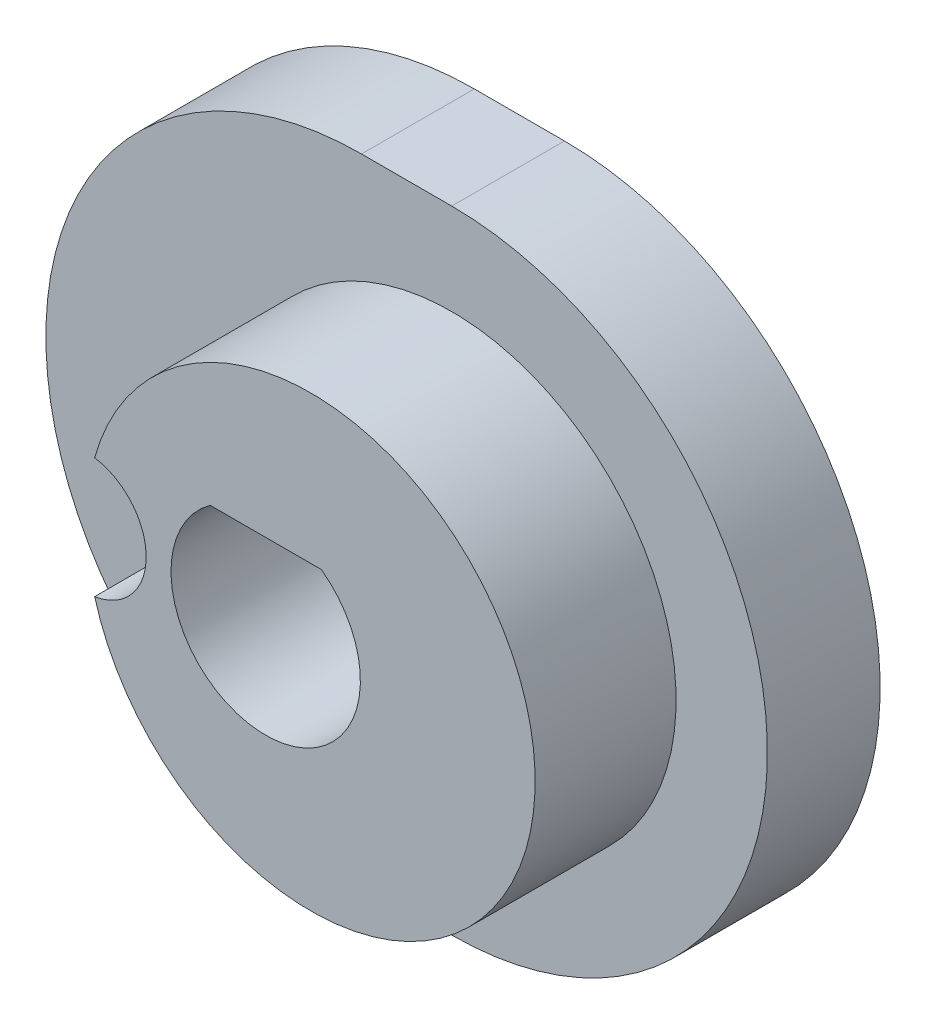
ISO-10303-21;
HEADER;
FILE_DESCRIPTION(('STEP AP214'),'2;1');
FILE_NAME('part.step','',(''),(''),'','','');
FILE_SCHEMA(('AUTOMOTIVE_DESIGN { 1 0 10303 214 1 1 1 1 }'));
ENDSEC;
DATA;
#1=APPLICATION_CONTEXT('core data for automotive mechanical design processes');
#2=APPLICATION_PROTOCOL_DEFINITION('international standard','automotive_design',2000,#1);
#3=PRODUCT_CONTEXT('',#1,'mechanical');
#4=PRODUCT('Part','Part','',(#3));
#5=PRODUCT_RELATED_PRODUCT_CATEGORY('part','',(#4));
#6=PRODUCT_DEFINITION_FORMATION('','',#4);
#7=PRODUCT_DEFINITION_CONTEXT('part definition',#1,'design');
#8=PRODUCT_DEFINITION('design','',#6,#7);
#9=PRODUCT_DEFINITION_SHAPE('','',#8);
#10=(LENGTH_UNIT() NAMED_UNIT(*) SI_UNIT(.MILLI.,.METRE.));
#11=(NAMED_UNIT(*) PLANE_ANGLE_UNIT() SI_UNIT($,.RADIAN.));
#12=(NAMED_UNIT(*) SI_UNIT($,.STERADIAN.) SOLID_ANGLE_UNIT());
#13=UNCERTAINTY_MEASURE_WITH_UNIT(LENGTH_MEASURE(1.E-05),#10,'distance_accuracy_value','');
#14=(GEOMETRIC_REPRESENTATION_CONTEXT(3) GLOBAL_UNCERTAINTY_ASSIGNED_CONTEXT((#13)) GLOBAL_UNIT_ASSIGNED_CONTEXT((#10,
#11,#12)) REPRESENTATION_CONTEXT('',''));
#15=CARTESIAN_POINT('',(0.,0.,0.));
#16=DIRECTION('',(0.,0.,1.));
#17=DIRECTION('',(1.,0.,0.));
#18=AXIS2_PLACEMENT_3D('',#15,#16,#17);
#19=CARTESIAN_POINT('',(2.54,0.,7.14375));
#20=DIRECTION('',(0.,0.,-1.));
#21=DIRECTION('',(-1.,0.,0.));
#22=AXIS2_PLACEMENT_3D('',#19,#20,#21);
#23=CYLINDRICAL_SURFACE('',#22,6.31825);
#24=DIRECTION('',(0.,0.,-1.));
#25=VECTOR('',#24,1.);
#26=CARTESIAN_POINT('',(-3.546871875,1.69418825395349,3.254375));
#27=LINE('',#26,#25);
#28=CARTESIAN_POINT('',(-3.546871875,1.69418825395349,7.14375));
#29=VERTEX_POINT('',#28);
#30=CARTESIAN_POINT('',(-3.546871875,1.69418825395349,3.175));
#31=VERTEX_POINT('',#30);
#32=EDGE_CURVE('E112',#29,#31,#27,.T.);
#33=ORIENTED_EDGE('',*,*,#32,.F.);
#34=CARTESIAN_POINT('',(2.54,0.,7.14375));
#35=DIRECTION('',(0.,0.,1.));
#36=DIRECTION('',(1.,0.,0.));
#37=AXIS2_PLACEMENT_3D('',#34,#35,#36);
#38=CIRCLE('',#37,6.31825);
#39=CARTESIAN_POINT('',(-3.546871875,-1.69418825395349,7.14375));
#40=VERTEX_POINT('',#39);
#41=EDGE_CURVE('E125',#40,#29,#38,.T.);
#42=ORIENTED_EDGE('',*,*,#41,.F.);
#43=DIRECTION('',(0.,0.,-1.));
#44=VECTOR('',#43,1.);
#45=CARTESIAN_POINT('',(-3.546871875,-1.69418825395349,3.254375));
#46=LINE('',#45,#44);
#47=CARTESIAN_POINT('',(-3.546871875,-1.6941882539535,3.175));
#48=VERTEX_POINT('',#47);
#49=EDGE_CURVE('E114',#48,#40,#46,.F.);
#50=ORIENTED_EDGE('',*,*,#49,.F.);
#51=CARTESIAN_POINT('',(2.54,0.,3.175));
#52=DIRECTION('',(0.,0.,1.));
#53=DIRECTION('',(1.,0.,0.));
#54=AXIS2_PLACEMENT_3D('',#51,#52,#53);
#55=CIRCLE('',#54,6.31825);
#56=EDGE_CURVE('E11',#48,#31,#55,.T.);
#57=ORIENTED_EDGE('',*,*,#56,.T.);
#58=EDGE_LOOP('',(#33,#42,#50,#57));
#59=FACE_BOUND('',#58,.T.);
#60=ADVANCED_FACE('F44',(#59),#23,.T.);
#61=CARTESIAN_POINT('',(2.54,0.,7.14375));
#62=DIRECTION('',(0.,0.,1.));
#63=DIRECTION('',(1.,0.,0.));
#64=AXIS2_PLACEMENT_3D('',#61,#62,#63);
#65=PLANE('',#64);
#66=CARTESIAN_POINT('',(1.27000000000009,0.,7.14375));
#67=DIRECTION('',(0.,0.,1.));
#68=DIRECTION('',(1.,0.,0.));
#69=AXIS2_PLACEMENT_3D('',#66,#67,#68);
#70=CIRCLE('',#69,2.667);
#71=CARTESIAN_POINT('',(-0.295761156754033,2.15899999999997,7.14375));
#72=VERTEX_POINT('',#71);
#73=CARTESIAN_POINT('',(2.83576115675421,2.15899999999997,7.14375));
#74=VERTEX_POINT('',#73);
#75=EDGE_CURVE('E127',#72,#74,#70,.T.);
#76=ORIENTED_EDGE('',*,*,#75,.F.);
#77=DIRECTION('',(-1.,0.,0.));
#78=VECTOR('',#77,1.);
#79=CARTESIAN_POINT('',(2.83576115675421,2.15899999999997,7.14375));
#80=LINE('',#79,#78);
#81=EDGE_CURVE('E139',#74,#72,#80,.T.);
#82=ORIENTED_EDGE('',*,*,#81,.F.);
#83=EDGE_LOOP('',(#76,#82));
#84=FACE_BOUND('',#83,.T.);
#85=CARTESIAN_POINT('',(-3.81,0.,7.14375));
#86=DIRECTION('',(0.,0.,1.));
#87=DIRECTION('',(1.,0.,0.));
#88=AXIS2_PLACEMENT_3D('',#85,#86,#87);
#89=CIRCLE('',#88,1.7145);
#90=EDGE_CURVE('E109',#40,#29,#89,.T.);
#91=ORIENTED_EDGE('',*,*,#90,.F.);
#92=ORIENTED_EDGE('',*,*,#41,.T.);
#93=EDGE_LOOP('',(#91,#92));
#94=FACE_BOUND('',#93,.T.);
#95=ADVANCED_FACE('F126',(#84,#94),#65,.T.);
#96=CARTESIAN_POINT('',(0.,0.,3.175));
#97=DIRECTION('',(0.,0.,-1.));
#98=DIRECTION('',(-1.,0.,0.));
#99=AXIS2_PLACEMENT_3D('',#96,#97,#98);
#100=CYLINDRICAL_SURFACE('',#99,8.89);
#101=CARTESIAN_POINT('',(0.,0.,0.));
#102=DIRECTION('',(0.,0.,1.));
#103=DIRECTION('',(1.,0.,0.));
#104=AXIS2_PLACEMENT_3D('',#101,#102,#103);
#105=CIRCLE('',#104,8.89);
#106=CARTESIAN_POINT('',(0.,8.89,0.));
#107=VERTEX_POINT('',#106);
#108=CARTESIAN_POINT('',(0.,-8.89,0.));
#109=VERTEX_POINT('',#108);
#110=EDGE_CURVE('E128',#107,#109,#105,.T.);
#111=ORIENTED_EDGE('',*,*,#110,.T.);
#112=DIRECTION('',(0.,0.,-1.));
#113=VECTOR('',#112,1.);
#114=CARTESIAN_POINT('',(0.,-8.89,3.175));
#115=LINE('',#114,#113);
#116=CARTESIAN_POINT('',(0.,-8.89,3.175));
#117=VERTEX_POINT('',#116);
#118=EDGE_CURVE('E47',#117,#109,#115,.T.);
#119=ORIENTED_EDGE('',*,*,#118,.F.);
#120=CARTESIAN_POINT('',(0.,0.,3.175));
#121=DIRECTION('',(0.,0.,1.));
#122=DIRECTION('',(1.,0.,0.));
#123=AXIS2_PLACEMENT_3D('',#120,#121,#122);
#124=CIRCLE('',#123,8.89);
#125=CARTESIAN_POINT('',(0.,8.89,3.175));
#126=VERTEX_POINT('',#125);
#127=EDGE_CURVE('E142',#126,#117,#124,.T.);
#128=ORIENTED_EDGE('',*,*,#127,.F.);
#129=DIRECTION('',(0.,0.,-1.));
#130=VECTOR('',#129,1.);
#131=CARTESIAN_POINT('',(0.,8.89,3.175));
#132=LINE('',#131,#130);
#133=EDGE_CURVE('E151',#126,#107,#132,.T.);
#134=ORIENTED_EDGE('',*,*,#133,.T.);
#135=EDGE_LOOP('',(#111,#119,#128,#134));
#136=FACE_BOUND('',#135,.T.);
#137=ADVANCED_FACE('F50',(#136),#100,.T.);
#138=CARTESIAN_POINT('',(0.,-8.89,3.175));
#139=DIRECTION('',(0.,1.,0.));
#140=DIRECTION('',(-1.,0.,0.));
#141=AXIS2_PLACEMENT_3D('',#138,#139,#140);
#142=PLANE('',#141);
#143=DIRECTION('',(1.,0.,0.));
#144=VECTOR('',#143,1.);
#145=CARTESIAN_POINT('',(0.,-8.89,0.));
#146=LINE('',#145,#144);
#147=CARTESIAN_POINT('',(2.54,-8.89,0.));
#148=VERTEX_POINT('',#147);
#149=EDGE_CURVE('E133',#109,#148,#146,.T.);
#150=ORIENTED_EDGE('',*,*,#149,.T.);
#151=DIRECTION('',(0.,0.,-1.));
#152=VECTOR('',#151,1.);
#153=CARTESIAN_POINT('',(2.54,-8.89,3.175));
#154=LINE('',#153,#152);
#155=CARTESIAN_POINT('',(2.54,-8.89,3.175));
#156=VERTEX_POINT('',#155);
#157=EDGE_CURVE('E169',#156,#148,#154,.T.);
#158=ORIENTED_EDGE('',*,*,#157,.F.);
#159=DIRECTION('',(1.,0.,0.));
#160=VECTOR('',#159,1.);
#161=CARTESIAN_POINT('',(0.,-8.89,3.175));
#162=LINE('',#161,#160);
#163=EDGE_CURVE('E143',#117,#156,#162,.T.);
#164=ORIENTED_EDGE('',*,*,#163,.F.);
#165=ORIENTED_EDGE('',*,*,#118,.T.);
#166=EDGE_LOOP('',(#150,#158,#164,#165));
#167=FACE_BOUND('',#166,.T.);
#168=ADVANCED_FACE('F179',(#167),#142,.F.);
#169=CARTESIAN_POINT('',(2.54,0.,3.175));
#170=DIRECTION('',(0.,0.,-1.));
#171=DIRECTION('',(-1.,0.,0.));
#172=AXIS2_PLACEMENT_3D('',#169,#170,#171);
#173=CYLINDRICAL_SURFACE('',#172,8.89);
#174=CARTESIAN_POINT('',(2.54,0.,0.));
#175=DIRECTION('',(0.,0.,1.));
#176=DIRECTION('',(1.,0.,0.));
#177=AXIS2_PLACEMENT_3D('',#174,#175,#176);
#178=CIRCLE('',#177,8.89);
#179=CARTESIAN_POINT('',(2.54,8.89,0.));
#180=VERTEX_POINT('',#179);
#181=EDGE_CURVE('E157',#148,#180,#178,.T.);
#182=ORIENTED_EDGE('',*,*,#181,.T.);
#183=DIRECTION('',(0.,0.,-1.));
#184=VECTOR('',#183,1.);
#185=CARTESIAN_POINT('',(2.54,8.89,3.175));
#186=LINE('',#185,#184);
#187=CARTESIAN_POINT('',(2.54,8.89,3.175));
#188=VERTEX_POINT('',#187);
#189=EDGE_CURVE('E168',#188,#180,#186,.T.);
#190=ORIENTED_EDGE('',*,*,#189,.F.);
#191=CARTESIAN_POINT('',(2.54,0.,3.175));
#192=DIRECTION('',(0.,0.,1.));
#193=DIRECTION('',(1.,0.,0.));
#194=AXIS2_PLACEMENT_3D('',#191,#192,#193);
#195=CIRCLE('',#194,8.89);
#196=EDGE_CURVE('E148',#156,#188,#195,.T.);
#197=ORIENTED_EDGE('',*,*,#196,.F.);
#198=ORIENTED_EDGE('',*,*,#157,.T.);
#199=EDGE_LOOP('',(#182,#190,#197,#198));
#200=FACE_BOUND('',#199,.T.);
#201=ADVANCED_FACE('F186',(#200),#173,.T.);
#202=CARTESIAN_POINT('',(0.,8.89,3.175));
#203=DIRECTION('',(0.,-1.,0.));
#204=DIRECTION('',(1.,0.,0.));
#205=AXIS2_PLACEMENT_3D('',#202,#203,#204);
#206=PLANE('',#205);
#207=DIRECTION('',(-1.,0.,0.));
#208=VECTOR('',#207,1.);
#209=CARTESIAN_POINT('',(0.,8.89,0.));
#210=LINE('',#209,#208);
#211=EDGE_CURVE('E149',#180,#107,#210,.T.);
#212=ORIENTED_EDGE('',*,*,#211,.T.);
#213=ORIENTED_EDGE('',*,*,#133,.F.);
#214=DIRECTION('',(-1.,0.,0.));
#215=VECTOR('',#214,1.);
#216=CARTESIAN_POINT('',(0.,8.89,3.175));
#217=LINE('',#216,#215);
#218=EDGE_CURVE('E154',#188,#126,#217,.T.);
#219=ORIENTED_EDGE('',*,*,#218,.F.);
#220=ORIENTED_EDGE('',*,*,#189,.T.);
#221=EDGE_LOOP('',(#212,#213,#219,#220));
#222=FACE_BOUND('',#221,.T.);
#223=ADVANCED_FACE('F191',(#222),#206,.F.);
#224=CARTESIAN_POINT('',(0.,0.,3.175));
#225=DIRECTION('',(0.,0.,1.));
#226=DIRECTION('',(1.,0.,0.));
#227=AXIS2_PLACEMENT_3D('',#224,#225,#226);
#228=PLANE('',#227);
#229=ORIENTED_EDGE('',*,*,#56,.F.);
#230=CARTESIAN_POINT('',(-3.81,0.,3.175));
#231=DIRECTION('',(0.,0.,1.));
#232=DIRECTION('',(1.,0.,0.));
#233=AXIS2_PLACEMENT_3D('',#230,#231,#232);
#234=CIRCLE('',#233,1.7145);
#235=EDGE_CURVE('E61',#48,#31,#234,.F.);
#236=ORIENTED_EDGE('',*,*,#235,.T.);
#237=EDGE_LOOP('',(#229,#236));
#238=FACE_BOUND('',#237,.T.);
#239=ORIENTED_EDGE('',*,*,#127,.T.);
#240=ORIENTED_EDGE('',*,*,#163,.T.);
#241=ORIENTED_EDGE('',*,*,#196,.T.);
#242=ORIENTED_EDGE('',*,*,#218,.T.);
#243=EDGE_LOOP('',(#239,#240,#241,#242));
#244=FACE_BOUND('',#243,.T.);
#245=ADVANCED_FACE('F193',(#238,#244),#228,.T.);
#246=CARTESIAN_POINT('',(0.,0.,0.));
#247=DIRECTION('',(0.,0.,1.));
#248=DIRECTION('',(1.,0.,0.));
#249=AXIS2_PLACEMENT_3D('',#246,#247,#248);
#250=PLANE('',#249);
#251=CARTESIAN_POINT('',(-3.81,0.,0.));
#252=DIRECTION('',(0.,0.,1.));
#253=DIRECTION('',(1.,0.,0.));
#254=AXIS2_PLACEMENT_3D('',#251,#252,#253);
#255=CIRCLE('',#254,1.7145);
#256=CARTESIAN_POINT('',(-2.0955,0.,0.));
#257=VERTEX_POINT('',#256);
#258=EDGE_CURVE('E123',#257,#257,#255,.F.);
#259=ORIENTED_EDGE('',*,*,#258,.F.);
#260=EDGE_LOOP('',(#259));
#261=FACE_BOUND('',#260,.T.);
#262=DIRECTION('',(-1.,0.,0.));
#263=VECTOR('',#262,1.);
#264=CARTESIAN_POINT('',(2.83576115675421,2.15899999999997,0.));
#265=LINE('',#264,#263);
#266=CARTESIAN_POINT('',(2.83576115675421,2.15899999999997,0.));
#267=VERTEX_POINT('',#266);
#268=CARTESIAN_POINT('',(-0.295761156754033,2.15899999999997,0.));
#269=VERTEX_POINT('',#268);
#270=EDGE_CURVE('E295',#267,#269,#265,.T.);
#271=ORIENTED_EDGE('',*,*,#270,.T.);
#272=CARTESIAN_POINT('',(1.27000000000009,0.,0.));
#273=DIRECTION('',(0.,0.,1.));
#274=DIRECTION('',(1.,0.,0.));
#275=AXIS2_PLACEMENT_3D('',#272,#273,#274);
#276=CIRCLE('',#275,2.667);
#277=EDGE_CURVE('E68',#269,#267,#276,.T.);
#278=ORIENTED_EDGE('',*,*,#277,.T.);
#279=EDGE_LOOP('',(#271,#278));
#280=FACE_BOUND('',#279,.T.);
#281=ORIENTED_EDGE('',*,*,#110,.F.);
#282=ORIENTED_EDGE('',*,*,#211,.F.);
#283=ORIENTED_EDGE('',*,*,#181,.F.);
#284=ORIENTED_EDGE('',*,*,#149,.F.);
#285=EDGE_LOOP('',(#281,#282,#283,#284));
#286=FACE_BOUND('',#285,.T.);
#287=ADVANCED_FACE('F190',(#261,#280,#286),#250,.F.);
#288=CARTESIAN_POINT('',(1.27000000000009,0.,0.));
#289=DIRECTION('',(0.,0.,1.));
#290=DIRECTION('',(1.,0.,0.));
#291=AXIS2_PLACEMENT_3D('',#288,#289,#290);
#292=CYLINDRICAL_SURFACE('',#291,2.667);
#293=DIRECTION('',(0.,0.,1.));
#294=VECTOR('',#293,1.);
#295=CARTESIAN_POINT('',(2.83576115675421,2.15899999999997,0.));
#296=LINE('',#295,#294);
#297=EDGE_CURVE('E287',#267,#74,#296,.T.);
#298=ORIENTED_EDGE('',*,*,#297,.F.);
#299=ORIENTED_EDGE('',*,*,#277,.F.);
#300=DIRECTION('',(0.,0.,1.));
#301=VECTOR('',#300,1.);
#302=CARTESIAN_POINT('',(-0.295761156754033,2.15899999999997,0.));
#303=LINE('',#302,#301);
#304=EDGE_CURVE('E294',#269,#72,#303,.T.);
#305=ORIENTED_EDGE('',*,*,#304,.T.);
#306=ORIENTED_EDGE('',*,*,#75,.T.);
#307=EDGE_LOOP('',(#298,#299,#305,#306));
#308=FACE_BOUND('',#307,.T.);
#309=ADVANCED_FACE('F204',(#308),#292,.F.);
#310=CARTESIAN_POINT('',(2.83576115675421,2.15899999999997,0.));
#311=DIRECTION('',(0.,1.,0.));
#312=DIRECTION('',(0.,0.,1.));
#313=AXIS2_PLACEMENT_3D('',#310,#311,#312);
#314=PLANE('',#313);
#315=ORIENTED_EDGE('',*,*,#304,.F.);
#316=ORIENTED_EDGE('',*,*,#270,.F.);
#317=ORIENTED_EDGE('',*,*,#297,.T.);
#318=ORIENTED_EDGE('',*,*,#81,.T.);
#319=EDGE_LOOP('',(#315,#316,#317,#318));
#320=FACE_BOUND('',#319,.T.);
#321=ADVANCED_FACE('F212',(#320),#314,.F.);
#322=CARTESIAN_POINT('',(-3.81,0.,7.14375));
#323=DIRECTION('',(0.,0.,-1.));
#324=DIRECTION('',(-1.,0.,0.));
#325=AXIS2_PLACEMENT_3D('',#322,#323,#324);
#326=CYLINDRICAL_SURFACE('',#325,1.7145);
#327=ORIENTED_EDGE('',*,*,#32,.T.);
#328=ORIENTED_EDGE('',*,*,#235,.F.);
#329=ORIENTED_EDGE('',*,*,#49,.T.);
#330=ORIENTED_EDGE('',*,*,#90,.T.);
#331=EDGE_LOOP('',(#327,#328,#329,#330));
#332=FACE_BOUND('',#331,.T.);
#333=ORIENTED_EDGE('',*,*,#258,.T.);
#334=EDGE_LOOP('',(#333));
#335=FACE_BOUND('',#334,.T.);
#336=ADVANCED_FACE('F115',(#332,#335),#326,.F.);
#337=CLOSED_SHELL('',(#60,#95,#137,#168,#201,#223,#245,#287,#309,#321,#336));
#338=MANIFOLD_SOLID_BREP('B2',#337);
#339=ADVANCED_BREP_SHAPE_REPRESENTATION('',(#18,#338),#14);
#340=SHAPE_DEFINITION_REPRESENTATION(#9,#339);
ENDSEC;
END-ISO-10303-21;
